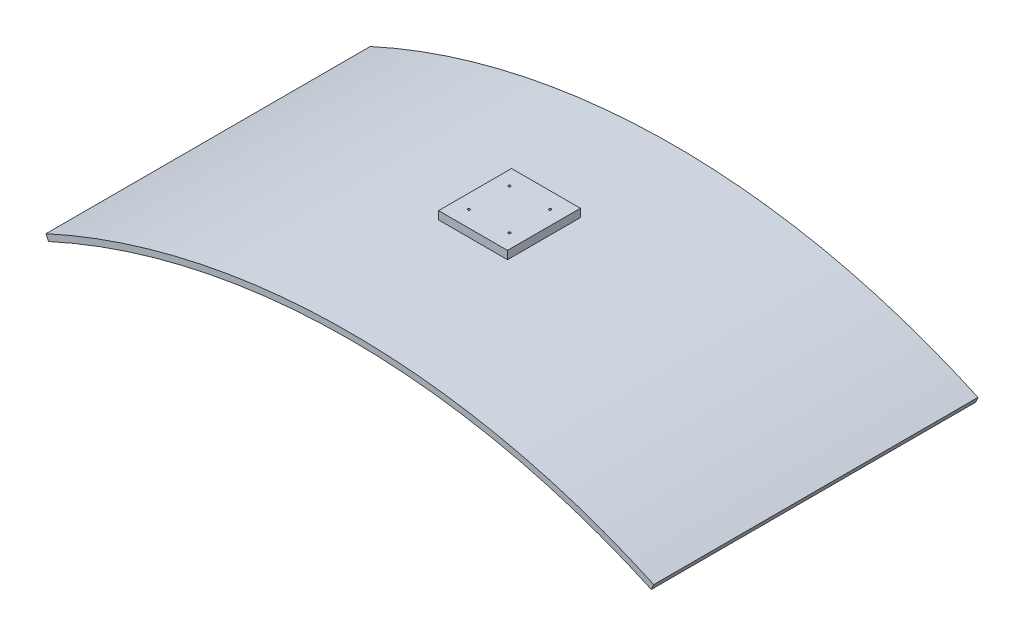
ISO-10303-21;
HEADER;
FILE_DESCRIPTION(('STEP AP214'),'2;1');
FILE_NAME('part.step','',(''),(''),'','','');
FILE_SCHEMA(('AUTOMOTIVE_DESIGN { 1 0 10303 214 1 1 1 1 }'));
ENDSEC;
DATA;
#1=APPLICATION_CONTEXT('core data for automotive mechanical design processes');
#2=APPLICATION_PROTOCOL_DEFINITION('international standard','automotive_design',2000,#1);
#3=PRODUCT_CONTEXT('',#1,'mechanical');
#4=PRODUCT('Part','Part','',(#3));
#5=PRODUCT_RELATED_PRODUCT_CATEGORY('part','',(#4));
#6=PRODUCT_DEFINITION_FORMATION('','',#4);
#7=PRODUCT_DEFINITION_CONTEXT('part definition',#1,'design');
#8=PRODUCT_DEFINITION('design','',#6,#7);
#9=PRODUCT_DEFINITION_SHAPE('','',#8);
#10=(LENGTH_UNIT() NAMED_UNIT(*) SI_UNIT(.MILLI.,.METRE.));
#11=(NAMED_UNIT(*) PLANE_ANGLE_UNIT() SI_UNIT($,.RADIAN.));
#12=(NAMED_UNIT(*) SI_UNIT($,.STERADIAN.) SOLID_ANGLE_UNIT());
#13=UNCERTAINTY_MEASURE_WITH_UNIT(LENGTH_MEASURE(1.E-05),#10,'distance_accuracy_value','');
#14=(GEOMETRIC_REPRESENTATION_CONTEXT(3) GLOBAL_UNCERTAINTY_ASSIGNED_CONTEXT((#13)) GLOBAL_UNIT_ASSIGNED_CONTEXT((#10,
#11,#12)) REPRESENTATION_CONTEXT('',''));
#15=CARTESIAN_POINT('',(0.,0.,0.));
#16=DIRECTION('',(0.,0.,1.));
#17=DIRECTION('',(1.,0.,0.));
#18=AXIS2_PLACEMENT_3D('',#15,#16,#17);
#19=CARTESIAN_POINT('',(788.75,163.693182804643,390.));
#20=DIRECTION('',(0.,1.,0.));
#21=DIRECTION('',(0.,0.,1.));
#22=AXIS2_PLACEMENT_3D('',#19,#20,#21);
#23=PLANE('',#22);
#24=DIRECTION('',(0.,0.,-1.));
#25=VECTOR('',#24,1.);
#26=CARTESIAN_POINT('',(698.75,163.693182804643,390.));
#27=LINE('',#26,#25);
#28=CARTESIAN_POINT('',(698.75,163.693182804643,410.));
#29=VERTEX_POINT('',#28);
#30=CARTESIAN_POINT('',(698.75,163.693182804643,390.));
#31=VERTEX_POINT('',#30);
#32=EDGE_CURVE('E150',#29,#31,#27,.T.);
#33=ORIENTED_EDGE('',*,*,#32,.T.);
#34=DIRECTION('',(-1.,0.,0.));
#35=VECTOR('',#34,1.);
#36=CARTESIAN_POINT('',(788.75,163.693182804643,390.));
#37=LINE('',#36,#35);
#38=CARTESIAN_POINT('',(788.75,163.693182804643,390.));
#39=VERTEX_POINT('',#38);
#40=EDGE_CURVE('E12',#39,#31,#37,.T.);
#41=ORIENTED_EDGE('',*,*,#40,.F.);
#42=DIRECTION('',(0.,0.,-1.));
#43=VECTOR('',#42,1.);
#44=CARTESIAN_POINT('',(788.75,163.693182804643,390.));
#45=LINE('',#44,#43);
#46=CARTESIAN_POINT('',(788.75,163.693182804643,410.));
#47=VERTEX_POINT('',#46);
#48=EDGE_CURVE('E159',#47,#39,#45,.T.);
#49=ORIENTED_EDGE('',*,*,#48,.F.);
#50=DIRECTION('',(-1.,0.,0.));
#51=VECTOR('',#50,1.);
#52=CARTESIAN_POINT('',(788.75,163.693182804643,410.));
#53=LINE('',#52,#51);
#54=EDGE_CURVE('E164',#47,#29,#53,.T.);
#55=ORIENTED_EDGE('',*,*,#54,.T.);
#56=EDGE_LOOP('',(#33,#41,#49,#55));
#57=FACE_BOUND('',#56,.T.);
#58=ADVANCED_FACE('F55',(#57),#23,.F.);
#59=CARTESIAN_POINT('',(788.75,163.693182804643,390.));
#60=DIRECTION('',(0.,0.,1.));
#61=DIRECTION('',(1.,0.,0.));
#62=AXIS2_PLACEMENT_3D('',#59,#60,#61);
#63=PLANE('',#62);
#64=DIRECTION('',(0.,1.,0.));
#65=VECTOR('',#64,1.);
#66=CARTESIAN_POINT('',(698.75,163.693182804643,390.));
#67=LINE('',#66,#65);
#68=CARTESIAN_POINT('',(698.75,203.693182804643,390.));
#69=VERTEX_POINT('',#68);
#70=EDGE_CURVE('E153',#31,#69,#67,.T.);
#71=ORIENTED_EDGE('',*,*,#70,.T.);
#72=DIRECTION('',(-1.,0.,0.));
#73=VECTOR('',#72,1.);
#74=CARTESIAN_POINT('',(788.75,203.693182804643,390.));
#75=LINE('',#74,#73);
#76=CARTESIAN_POINT('',(788.75,203.693182804643,390.));
#77=VERTEX_POINT('',#76);
#78=EDGE_CURVE('E63',#77,#69,#75,.T.);
#79=ORIENTED_EDGE('',*,*,#78,.F.);
#80=DIRECTION('',(0.,1.,0.));
#81=VECTOR('',#80,1.);
#82=CARTESIAN_POINT('',(788.75,163.693182804643,390.));
#83=LINE('',#82,#81);
#84=EDGE_CURVE('E95',#39,#77,#83,.T.);
#85=ORIENTED_EDGE('',*,*,#84,.F.);
#86=ORIENTED_EDGE('',*,*,#40,.T.);
#87=EDGE_LOOP('',(#71,#79,#85,#86));
#88=FACE_BOUND('',#87,.T.);
#89=ADVANCED_FACE('F177',(#88),#63,.F.);
#90=CARTESIAN_POINT('',(788.75,163.693182804643,410.));
#91=DIRECTION('',(0.,0.,-1.));
#92=DIRECTION('',(-1.,0.,0.));
#93=AXIS2_PLACEMENT_3D('',#90,#91,#92);
#94=PLANE('',#93);
#95=DIRECTION('',(0.,-1.,0.));
#96=VECTOR('',#95,1.);
#97=CARTESIAN_POINT('',(698.75,163.693182804643,410.));
#98=LINE('',#97,#96);
#99=CARTESIAN_POINT('',(698.75,203.693182804643,410.));
#100=VERTEX_POINT('',#99);
#101=EDGE_CURVE('E88',#100,#29,#98,.T.);
#102=ORIENTED_EDGE('',*,*,#101,.T.);
#103=ORIENTED_EDGE('',*,*,#54,.F.);
#104=DIRECTION('',(0.,-1.,0.));
#105=VECTOR('',#104,1.);
#106=CARTESIAN_POINT('',(788.75,163.693182804643,410.));
#107=LINE('',#106,#105);
#108=CARTESIAN_POINT('',(788.75,203.693182804643,410.));
#109=VERTEX_POINT('',#108);
#110=EDGE_CURVE('E71',#109,#47,#107,.T.);
#111=ORIENTED_EDGE('',*,*,#110,.F.);
#112=DIRECTION('',(-1.,0.,0.));
#113=VECTOR('',#112,1.);
#114=CARTESIAN_POINT('',(788.75,203.693182804643,410.));
#115=LINE('',#114,#113);
#116=EDGE_CURVE('E85',#109,#100,#115,.T.);
#117=ORIENTED_EDGE('',*,*,#116,.T.);
#118=EDGE_LOOP('',(#102,#103,#111,#117));
#119=FACE_BOUND('',#118,.T.);
#120=ADVANCED_FACE('F184',(#119),#94,.F.);
#121=CARTESIAN_POINT('',(788.75,0.,0.));
#122=DIRECTION('',(-1.,0.,0.));
#123=DIRECTION('',(0.,0.,1.));
#124=AXIS2_PLACEMENT_3D('',#121,#122,#123);
#125=PLANE('',#124);
#126=ORIENTED_EDGE('',*,*,#48,.T.);
#127=ORIENTED_EDGE('',*,*,#84,.T.);
#128=DIRECTION('',(0.,0.,1.));
#129=VECTOR('',#128,1.);
#130=CARTESIAN_POINT('',(788.75,203.693182804643,410.));
#131=LINE('',#130,#129);
#132=EDGE_CURVE('E162',#77,#109,#131,.T.);
#133=ORIENTED_EDGE('',*,*,#132,.T.);
#134=ORIENTED_EDGE('',*,*,#110,.T.);
#135=EDGE_LOOP('',(#126,#127,#133,#134));
#136=FACE_BOUND('',#135,.T.);
#137=ADVANCED_FACE('F186',(#136),#125,.F.);
#138=CARTESIAN_POINT('',(698.75,0.,0.));
#139=DIRECTION('',(-1.,0.,0.));
#140=DIRECTION('',(0.,0.,1.));
#141=AXIS2_PLACEMENT_3D('',#138,#139,#140);
#142=PLANE('',#141);
#143=ORIENTED_EDGE('',*,*,#32,.F.);
#144=ORIENTED_EDGE('',*,*,#101,.F.);
#145=DIRECTION('',(0.,0.,1.));
#146=VECTOR('',#145,1.);
#147=CARTESIAN_POINT('',(698.75,203.693182804643,410.));
#148=LINE('',#147,#146);
#149=EDGE_CURVE('E168',#69,#100,#148,.T.);
#150=ORIENTED_EDGE('',*,*,#149,.F.);
#151=ORIENTED_EDGE('',*,*,#70,.F.);
#152=EDGE_LOOP('',(#143,#144,#150,#151));
#153=FACE_BOUND('',#152,.T.);
#154=ADVANCED_FACE('F181',(#153),#142,.T.);
#155=CARTESIAN_POINT('',(0.,203.693182804643,0.));
#156=DIRECTION('',(0.,1.,0.));
#157=DIRECTION('',(0.,0.,1.));
#158=AXIS2_PLACEMENT_3D('',#155,#156,#157);
#159=PLANE('',#158);
#160=CARTESIAN_POINT('',(793.829806204046,203.693182804643,450.));
#161=DIRECTION('',(0.,1.,0.));
#162=DIRECTION('',(0.,0.,1.));
#163=AXIS2_PLACEMENT_3D('',#160,#161,#162);
#164=CIRCLE('',#163,2.99999999999993);
#165=CARTESIAN_POINT('',(793.829806204046,203.693182804643,452.999999999999));
#166=VERTEX_POINT('',#165);
#167=EDGE_CURVE('E320',#166,#166,#164,.T.);
#168=ORIENTED_EDGE('',*,*,#167,.T.);
#169=EDGE_LOOP('',(#168));
#170=FACE_BOUND('',#169,.T.);
#171=CARTESIAN_POINT('',(693.829806204047,203.693182804643,349.999999999998));
#172=DIRECTION('',(0.,1.,0.));
#173=DIRECTION('',(0.,0.,1.));
#174=AXIS2_PLACEMENT_3D('',#171,#172,#173);
#175=CIRCLE('',#174,3.00000000000005);
#176=CARTESIAN_POINT('',(693.829806204047,203.693182804643,352.999999999998));
#177=VERTEX_POINT('',#176);
#178=EDGE_CURVE('E337',#177,#177,#175,.T.);
#179=ORIENTED_EDGE('',*,*,#178,.T.);
#180=EDGE_LOOP('',(#179));
#181=FACE_BOUND('',#180,.T.);
#182=CARTESIAN_POINT('',(793.829806204047,203.693182804643,350.));
#183=DIRECTION('',(0.,1.,0.));
#184=DIRECTION('',(0.,0.,1.));
#185=AXIS2_PLACEMENT_3D('',#182,#183,#184);
#186=CIRCLE('',#185,3.00000000000005);
#187=CARTESIAN_POINT('',(793.829806204047,203.693182804643,353.));
#188=VERTEX_POINT('',#187);
#189=EDGE_CURVE('E332',#188,#188,#186,.T.);
#190=ORIENTED_EDGE('',*,*,#189,.T.);
#191=EDGE_LOOP('',(#190));
#192=FACE_BOUND('',#191,.T.);
#193=CARTESIAN_POINT('',(693.829806204046,203.693182804643,449.999999999998));
#194=DIRECTION('',(0.,1.,0.));
#195=DIRECTION('',(0.,0.,1.));
#196=AXIS2_PLACEMENT_3D('',#193,#194,#195);
#197=CIRCLE('',#196,3.00000000000005);
#198=CARTESIAN_POINT('',(693.829806204046,203.693182804643,452.999999999998));
#199=VERTEX_POINT('',#198);
#200=EDGE_CURVE('E327',#199,#199,#197,.T.);
#201=ORIENTED_EDGE('',*,*,#200,.T.);
#202=EDGE_LOOP('',(#201));
#203=FACE_BOUND('',#202,.T.);
#204=DIRECTION('',(0.,0.,-1.));
#205=VECTOR('',#204,1.);
#206=CARTESIAN_POINT('',(828.829806203977,203.693182804643,310.));
#207=LINE('',#206,#205);
#208=CARTESIAN_POINT('',(828.829806203977,203.693182804643,490.));
#209=VERTEX_POINT('',#208);
#210=CARTESIAN_POINT('',(828.829806203977,203.693182804643,310.));
#211=VERTEX_POINT('',#210);
#212=EDGE_CURVE('E149',#209,#211,#207,.T.);
#213=ORIENTED_EDGE('',*,*,#212,.F.);
#214=DIRECTION('',(1.,0.,0.));
#215=VECTOR('',#214,1.);
#216=CARTESIAN_POINT('',(658.829806203977,203.693182804643,490.));
#217=LINE('',#216,#215);
#218=CARTESIAN_POINT('',(658.829806203977,203.693182804643,490.));
#219=VERTEX_POINT('',#218);
#220=EDGE_CURVE('E145',#219,#209,#217,.T.);
#221=ORIENTED_EDGE('',*,*,#220,.F.);
#222=DIRECTION('',(0.,0.,1.));
#223=VECTOR('',#222,1.);
#224=CARTESIAN_POINT('',(658.829806203977,203.693182804643,310.));
#225=LINE('',#224,#223);
#226=CARTESIAN_POINT('',(658.829806203977,203.693182804643,310.));
#227=VERTEX_POINT('',#226);
#228=EDGE_CURVE('E349',#227,#219,#225,.T.);
#229=ORIENTED_EDGE('',*,*,#228,.F.);
#230=DIRECTION('',(-1.,0.,0.));
#231=VECTOR('',#230,1.);
#232=CARTESIAN_POINT('',(658.829806203977,203.693182804643,310.));
#233=LINE('',#232,#231);
#234=EDGE_CURVE('E347',#211,#227,#233,.T.);
#235=ORIENTED_EDGE('',*,*,#234,.F.);
#236=EDGE_LOOP('',(#213,#221,#229,#235));
#237=FACE_BOUND('',#236,.T.);
#238=ORIENTED_EDGE('',*,*,#78,.T.);
#239=ORIENTED_EDGE('',*,*,#149,.T.);
#240=ORIENTED_EDGE('',*,*,#116,.F.);
#241=ORIENTED_EDGE('',*,*,#132,.F.);
#242=EDGE_LOOP('',(#238,#239,#240,#241));
#243=FACE_BOUND('',#242,.T.);
#244=ADVANCED_FACE('F176',(#170,#181,#192,#203,#237,#243),#159,.F.);
#245=CARTESIAN_POINT('',(828.829806203977,223.693182804643,310.));
#246=DIRECTION('',(-1.,0.,0.));
#247=DIRECTION('',(0.,0.,1.));
#248=AXIS2_PLACEMENT_3D('',#245,#246,#247);
#249=PLANE('',#248);
#250=ORIENTED_EDGE('',*,*,#212,.T.);
#251=DIRECTION('',(0.,-1.,0.));
#252=VECTOR('',#251,1.);
#253=CARTESIAN_POINT('',(828.829806203977,223.693182804643,310.));
#254=LINE('',#253,#252);
#255=CARTESIAN_POINT('',(828.829806203977,223.693182804643,310.));
#256=VERTEX_POINT('',#255);
#257=EDGE_CURVE('E129',#256,#211,#254,.T.);
#258=ORIENTED_EDGE('',*,*,#257,.F.);
#259=DIRECTION('',(0.,0.,-1.));
#260=VECTOR('',#259,1.);
#261=CARTESIAN_POINT('',(828.829806203977,223.693182804643,310.));
#262=LINE('',#261,#260);
#263=CARTESIAN_POINT('',(828.829806203977,223.693182804643,490.));
#264=VERTEX_POINT('',#263);
#265=EDGE_CURVE('E136',#264,#256,#262,.T.);
#266=ORIENTED_EDGE('',*,*,#265,.F.);
#267=DIRECTION('',(0.,-1.,0.));
#268=VECTOR('',#267,1.);
#269=CARTESIAN_POINT('',(828.829806203977,223.693182804643,490.));
#270=LINE('',#269,#268);
#271=EDGE_CURVE('E345',#264,#209,#270,.T.);
#272=ORIENTED_EDGE('',*,*,#271,.T.);
#273=EDGE_LOOP('',(#250,#258,#266,#272));
#274=FACE_BOUND('',#273,.T.);
#275=ADVANCED_FACE('F147',(#274),#249,.F.);
#276=CARTESIAN_POINT('',(658.829806203977,223.693182804643,310.));
#277=DIRECTION('',(0.,0.,1.));
#278=DIRECTION('',(1.,0.,0.));
#279=AXIS2_PLACEMENT_3D('',#276,#277,#278);
#280=PLANE('',#279);
#281=ORIENTED_EDGE('',*,*,#234,.T.);
#282=DIRECTION('',(0.,-1.,0.));
#283=VECTOR('',#282,1.);
#284=CARTESIAN_POINT('',(658.829806203977,223.693182804643,310.));
#285=LINE('',#284,#283);
#286=CARTESIAN_POINT('',(658.829806203977,223.693182804643,310.));
#287=VERTEX_POINT('',#286);
#288=EDGE_CURVE('E132',#287,#227,#285,.T.);
#289=ORIENTED_EDGE('',*,*,#288,.F.);
#290=DIRECTION('',(-1.,0.,0.));
#291=VECTOR('',#290,1.);
#292=CARTESIAN_POINT('',(658.829806203977,223.693182804643,310.));
#293=LINE('',#292,#291);
#294=EDGE_CURVE('E125',#256,#287,#293,.T.);
#295=ORIENTED_EDGE('',*,*,#294,.F.);
#296=ORIENTED_EDGE('',*,*,#257,.T.);
#297=EDGE_LOOP('',(#281,#289,#295,#296));
#298=FACE_BOUND('',#297,.T.);
#299=ADVANCED_FACE('F127',(#298),#280,.F.);
#300=CARTESIAN_POINT('',(658.829806203977,223.693182804643,310.));
#301=DIRECTION('',(1.,0.,0.));
#302=DIRECTION('',(0.,0.,-1.));
#303=AXIS2_PLACEMENT_3D('',#300,#301,#302);
#304=PLANE('',#303);
#305=ORIENTED_EDGE('',*,*,#228,.T.);
#306=DIRECTION('',(0.,-1.,0.));
#307=VECTOR('',#306,1.);
#308=CARTESIAN_POINT('',(658.829806203977,223.693182804643,490.));
#309=LINE('',#308,#307);
#310=CARTESIAN_POINT('',(658.829806203977,223.693182804643,490.));
#311=VERTEX_POINT('',#310);
#312=EDGE_CURVE('E155',#311,#219,#309,.T.);
#313=ORIENTED_EDGE('',*,*,#312,.F.);
#314=DIRECTION('',(0.,0.,1.));
#315=VECTOR('',#314,1.);
#316=CARTESIAN_POINT('',(658.829806203977,223.693182804643,310.));
#317=LINE('',#316,#315);
#318=EDGE_CURVE('E135',#287,#311,#317,.T.);
#319=ORIENTED_EDGE('',*,*,#318,.F.);
#320=ORIENTED_EDGE('',*,*,#288,.T.);
#321=EDGE_LOOP('',(#305,#313,#319,#320));
#322=FACE_BOUND('',#321,.T.);
#323=ADVANCED_FACE('F248',(#322),#304,.F.);
#324=CARTESIAN_POINT('',(658.829806203977,223.693182804643,490.));
#325=DIRECTION('',(0.,0.,-1.));
#326=DIRECTION('',(-1.,0.,0.));
#327=AXIS2_PLACEMENT_3D('',#324,#325,#326);
#328=PLANE('',#327);
#329=ORIENTED_EDGE('',*,*,#220,.T.);
#330=ORIENTED_EDGE('',*,*,#271,.F.);
#331=DIRECTION('',(1.,0.,0.));
#332=VECTOR('',#331,1.);
#333=CARTESIAN_POINT('',(658.829806203977,223.693182804643,490.));
#334=LINE('',#333,#332);
#335=EDGE_CURVE('E141',#311,#264,#334,.T.);
#336=ORIENTED_EDGE('',*,*,#335,.F.);
#337=ORIENTED_EDGE('',*,*,#312,.T.);
#338=EDGE_LOOP('',(#329,#330,#336,#337));
#339=FACE_BOUND('',#338,.T.);
#340=ADVANCED_FACE('F257',(#339),#328,.F.);
#341=CARTESIAN_POINT('',(0.,223.693182804643,0.));
#342=DIRECTION('',(0.,1.,0.));
#343=DIRECTION('',(0.,0.,1.));
#344=AXIS2_PLACEMENT_3D('',#341,#342,#343);
#345=PLANE('',#344);
#346=CARTESIAN_POINT('',(793.829806204046,223.693182804643,450.));
#347=DIRECTION('',(0.,1.,0.));
#348=DIRECTION('',(0.,0.,1.));
#349=AXIS2_PLACEMENT_3D('',#346,#347,#348);
#350=CIRCLE('',#349,2.99999999999993);
#351=CARTESIAN_POINT('',(793.829806204046,223.693182804643,452.999999999999));
#352=VERTEX_POINT('',#351);
#353=EDGE_CURVE('E323',#352,#352,#350,.T.);
#354=ORIENTED_EDGE('',*,*,#353,.F.);
#355=EDGE_LOOP('',(#354));
#356=FACE_BOUND('',#355,.T.);
#357=CARTESIAN_POINT('',(693.829806204047,223.693182804643,349.999999999998));
#358=DIRECTION('',(0.,1.,0.));
#359=DIRECTION('',(0.,0.,1.));
#360=AXIS2_PLACEMENT_3D('',#357,#358,#359);
#361=CIRCLE('',#360,3.00000000000005);
#362=CARTESIAN_POINT('',(693.829806204047,223.693182804643,352.999999999998));
#363=VERTEX_POINT('',#362);
#364=EDGE_CURVE('E329',#363,#363,#361,.T.);
#365=ORIENTED_EDGE('',*,*,#364,.F.);
#366=EDGE_LOOP('',(#365));
#367=FACE_BOUND('',#366,.T.);
#368=CARTESIAN_POINT('',(793.829806204047,223.693182804643,350.));
#369=DIRECTION('',(0.,1.,0.));
#370=DIRECTION('',(0.,0.,1.));
#371=AXIS2_PLACEMENT_3D('',#368,#369,#370);
#372=CIRCLE('',#371,3.00000000000005);
#373=CARTESIAN_POINT('',(793.829806204047,223.693182804643,353.));
#374=VERTEX_POINT('',#373);
#375=EDGE_CURVE('E340',#374,#374,#372,.T.);
#376=ORIENTED_EDGE('',*,*,#375,.F.);
#377=EDGE_LOOP('',(#376));
#378=FACE_BOUND('',#377,.T.);
#379=CARTESIAN_POINT('',(693.829806204046,223.693182804643,449.999999999998));
#380=DIRECTION('',(0.,1.,0.));
#381=DIRECTION('',(0.,0.,1.));
#382=AXIS2_PLACEMENT_3D('',#379,#380,#381);
#383=CIRCLE('',#382,3.00000000000005);
#384=CARTESIAN_POINT('',(693.829806204046,223.693182804643,452.999999999998));
#385=VERTEX_POINT('',#384);
#386=EDGE_CURVE('E324',#385,#385,#383,.T.);
#387=ORIENTED_EDGE('',*,*,#386,.F.);
#388=EDGE_LOOP('',(#387));
#389=FACE_BOUND('',#388,.T.);
#390=ORIENTED_EDGE('',*,*,#265,.T.);
#391=ORIENTED_EDGE('',*,*,#294,.T.);
#392=ORIENTED_EDGE('',*,*,#318,.T.);
#393=ORIENTED_EDGE('',*,*,#335,.T.);
#394=EDGE_LOOP('',(#390,#391,#392,#393));
#395=FACE_BOUND('',#394,.T.);
#396=ADVANCED_FACE('F139',(#356,#367,#378,#389,#395),#345,.T.);
#397=CARTESIAN_POINT('',(693.829806204046,203.693182804643,449.999999999998));
#398=DIRECTION('',(0.,1.,0.));
#399=DIRECTION('',(0.,0.,1.));
#400=AXIS2_PLACEMENT_3D('',#397,#398,#399);
#401=CYLINDRICAL_SURFACE('',#400,3.00000000000005);
#402=ORIENTED_EDGE('',*,*,#200,.F.);
#403=EDGE_LOOP('',(#402));
#404=FACE_BOUND('',#403,.T.);
#405=ORIENTED_EDGE('',*,*,#386,.T.);
#406=EDGE_LOOP('',(#405));
#407=FACE_BOUND('',#406,.T.);
#408=ADVANCED_FACE('F274',(#404,#407),#401,.F.);
#409=CARTESIAN_POINT('',(793.829806204047,203.693182804643,350.));
#410=DIRECTION('',(0.,1.,0.));
#411=DIRECTION('',(0.,0.,1.));
#412=AXIS2_PLACEMENT_3D('',#409,#410,#411);
#413=CYLINDRICAL_SURFACE('',#412,3.00000000000005);
#414=ORIENTED_EDGE('',*,*,#189,.F.);
#415=EDGE_LOOP('',(#414));
#416=FACE_BOUND('',#415,.T.);
#417=ORIENTED_EDGE('',*,*,#375,.T.);
#418=EDGE_LOOP('',(#417));
#419=FACE_BOUND('',#418,.T.);
#420=ADVANCED_FACE('F284',(#416,#419),#413,.F.);
#421=CARTESIAN_POINT('',(693.829806204047,203.693182804643,349.999999999998));
#422=DIRECTION('',(0.,1.,0.));
#423=DIRECTION('',(0.,0.,1.));
#424=AXIS2_PLACEMENT_3D('',#421,#422,#423);
#425=CYLINDRICAL_SURFACE('',#424,3.00000000000005);
#426=ORIENTED_EDGE('',*,*,#178,.F.);
#427=EDGE_LOOP('',(#426));
#428=FACE_BOUND('',#427,.T.);
#429=ORIENTED_EDGE('',*,*,#364,.T.);
#430=EDGE_LOOP('',(#429));
#431=FACE_BOUND('',#430,.T.);
#432=ADVANCED_FACE('F294',(#428,#431),#425,.F.);
#433=CARTESIAN_POINT('',(793.829806204046,203.693182804643,450.));
#434=DIRECTION('',(0.,1.,0.));
#435=DIRECTION('',(0.,0.,1.));
#436=AXIS2_PLACEMENT_3D('',#433,#434,#435);
#437=CYLINDRICAL_SURFACE('',#436,2.99999999999993);
#438=ORIENTED_EDGE('',*,*,#167,.F.);
#439=EDGE_LOOP('',(#438));
#440=FACE_BOUND('',#439,.T.);
#441=ORIENTED_EDGE('',*,*,#353,.T.);
#442=EDGE_LOOP('',(#441));
#443=FACE_BOUND('',#442,.T.);
#444=ADVANCED_FACE('F304',(#440,#443),#437,.F.);
#445=CLOSED_SHELL('',(#58,#89,#120,#137,#154,#244,#275,#299,#323,#340,#396,#408,#420,#432,#444));
#446=MANIFOLD_SOLID_BREP('B2',#445);
#447=CARTESIAN_POINT('',(750.,-1636.30681719536,800.));
#448=DIRECTION('',(0.,0.,-1.));
#449=DIRECTION('',(-1.,0.,0.));
#450=AXIS2_PLACEMENT_3D('',#447,#448,#449);
#451=CYLINDRICAL_SURFACE('',#450,1785.);
#452=CARTESIAN_POINT('',(750.,-1636.30681719536,0.));
#453=DIRECTION('',(0.,0.,1.));
#454=DIRECTION('',(1.,0.,0.));
#455=AXIS2_PLACEMENT_3D('',#452,#453,#454);
#456=CIRCLE('',#455,1785.);
#457=CARTESIAN_POINT('',(6.24999999999976,-13.6358901432947,0.));
#458=VERTEX_POINT('',#457);
#459=CARTESIAN_POINT('',(1493.75,-13.6358901432949,0.));
#460=VERTEX_POINT('',#459);
#461=EDGE_CURVE('E487',#458,#460,#456,.F.);
#462=ORIENTED_EDGE('',*,*,#461,.T.);
#463=DIRECTION('',(0.,0.,-1.));
#464=VECTOR('',#463,1.);
#465=CARTESIAN_POINT('',(1493.75,-13.6358901432949,800.));
#466=LINE('',#465,#464);
#467=CARTESIAN_POINT('',(1493.75,-13.6358901432949,800.));
#468=VERTEX_POINT('',#467);
#469=EDGE_CURVE('E53',#468,#460,#466,.T.);
#470=ORIENTED_EDGE('',*,*,#469,.F.);
#471=CARTESIAN_POINT('',(750.,-1636.30681719536,800.));
#472=DIRECTION('',(0.,0.,1.));
#473=DIRECTION('',(1.,0.,0.));
#474=AXIS2_PLACEMENT_3D('',#471,#472,#473);
#475=CIRCLE('',#474,1785.);
#476=CARTESIAN_POINT('',(6.24999999999976,-13.6358901432947,800.));
#477=VERTEX_POINT('',#476);
#478=EDGE_CURVE('E426',#477,#468,#475,.F.);
#479=ORIENTED_EDGE('',*,*,#478,.F.);
#480=DIRECTION('',(0.,0.,-1.));
#481=VECTOR('',#480,1.);
#482=CARTESIAN_POINT('',(6.24999999999976,-13.6358901432947,800.));
#483=LINE('',#482,#481);
#484=EDGE_CURVE('E401',#477,#458,#483,.T.);
#485=ORIENTED_EDGE('',*,*,#484,.T.);
#486=EDGE_LOOP('',(#462,#470,#479,#485));
#487=FACE_BOUND('',#486,.T.);
#488=CARTESIAN_POINT('',(750.,-1636.30681719536,10.));
#489=DIRECTION('',(0.,0.,-1.));
#490=DIRECTION('',(1.,0.,0.));
#491=AXIS2_PLACEMENT_3D('',#488,#489,#490);
#492=CIRCLE('',#491,1785.);
#493=CARTESIAN_POINT('',(15.3522648556415,-9.49468752356689,10.));
#494=VERTEX_POINT('',#493);
#495=CARTESIAN_POINT('',(1484.64773514436,-9.49468752356708,10.));
#496=VERTEX_POINT('',#495);
#497=EDGE_CURVE('E470',#494,#496,#492,.T.);
#498=ORIENTED_EDGE('',*,*,#497,.F.);
#499=DIRECTION('',(0.,0.,1.));
#500=VECTOR('',#499,1.);
#501=CARTESIAN_POINT('',(15.3522648556415,-9.49468752356689,10.));
#502=LINE('',#501,#500);
#503=CARTESIAN_POINT('',(15.3522648556415,-9.49468752356689,790.));
#504=VERTEX_POINT('',#503);
#505=EDGE_CURVE('E461',#494,#504,#502,.T.);
#506=ORIENTED_EDGE('',*,*,#505,.T.);
#507=CARTESIAN_POINT('',(750.,-1636.30681719536,790.));
#508=DIRECTION('',(0.,0.,-1.));
#509=DIRECTION('',(1.,0.,0.));
#510=AXIS2_PLACEMENT_3D('',#507,#508,#509);
#511=CIRCLE('',#510,1785.);
#512=CARTESIAN_POINT('',(1484.64773514436,-9.49468752356708,790.));
#513=VERTEX_POINT('',#512);
#514=EDGE_CURVE('E475',#504,#513,#511,.T.);
#515=ORIENTED_EDGE('',*,*,#514,.T.);
#516=DIRECTION('',(0.,0.,1.));
#517=VECTOR('',#516,1.);
#518=CARTESIAN_POINT('',(1484.64773514436,-9.49468752356708,10.));
#519=LINE('',#518,#517);
#520=EDGE_CURVE('E488',#496,#513,#519,.T.);
#521=ORIENTED_EDGE('',*,*,#520,.F.);
#522=EDGE_LOOP('',(#498,#506,#515,#521));
#523=FACE_BOUND('',#522,.T.);
#524=ADVANCED_FACE('F378',(#487,#523),#451,.F.);
#525=CARTESIAN_POINT('',(1500.,0.,800.));
#526=DIRECTION('',(0.909059342886316,-0.416666666666652,0.));
#527=DIRECTION('',(0.416666666666652,0.909059342886316,0.));
#528=AXIS2_PLACEMENT_3D('',#525,#526,#527);
#529=PLANE('',#528);
#530=DIRECTION('',(-0.416666666666652,-0.909059342886316,0.));
#531=VECTOR('',#530,1.);
#532=CARTESIAN_POINT('',(1500.,0.,0.));
#533=LINE('',#532,#531);
#534=CARTESIAN_POINT('',(1500.,0.,0.));
#535=VERTEX_POINT('',#534);
#536=EDGE_CURVE('E502',#535,#460,#533,.T.);
#537=ORIENTED_EDGE('',*,*,#536,.F.);
#538=DIRECTION('',(0.,0.,-1.));
#539=VECTOR('',#538,1.);
#540=CARTESIAN_POINT('',(1500.,0.,800.));
#541=LINE('',#540,#539);
#542=CARTESIAN_POINT('',(1500.,0.,800.));
#543=VERTEX_POINT('',#542);
#544=EDGE_CURVE('E385',#543,#535,#541,.T.);
#545=ORIENTED_EDGE('',*,*,#544,.F.);
#546=DIRECTION('',(-0.416666666666652,-0.909059342886316,0.));
#547=VECTOR('',#546,1.);
#548=CARTESIAN_POINT('',(1500.,0.,800.));
#549=LINE('',#548,#547);
#550=EDGE_CURVE('E492',#543,#468,#549,.T.);
#551=ORIENTED_EDGE('',*,*,#550,.T.);
#552=ORIENTED_EDGE('',*,*,#469,.T.);
#553=EDGE_LOOP('',(#537,#545,#551,#552));
#554=FACE_BOUND('',#553,.T.);
#555=ADVANCED_FACE('F518',(#554),#529,.T.);
#556=CARTESIAN_POINT('',(750.,-1636.30681719536,800.));
#557=DIRECTION('',(0.,0.,-1.));
#558=DIRECTION('',(-1.,0.,0.));
#559=AXIS2_PLACEMENT_3D('',#556,#557,#558);
#560=CYLINDRICAL_SURFACE('',#559,1800.);
#561=CARTESIAN_POINT('',(750.,-1636.30681719536,0.));
#562=DIRECTION('',(0.,0.,-1.));
#563=DIRECTION('',(-1.,0.,0.));
#564=AXIS2_PLACEMENT_3D('',#561,#562,#563);
#565=CIRCLE('',#564,1800.);
#566=CARTESIAN_POINT('',(0.,0.,0.));
#567=VERTEX_POINT('',#566);
#568=EDGE_CURVE('E505',#567,#535,#565,.T.);
#569=ORIENTED_EDGE('',*,*,#568,.F.);
#570=DIRECTION('',(0.,0.,-1.));
#571=VECTOR('',#570,1.);
#572=CARTESIAN_POINT('',(0.,0.,800.));
#573=LINE('',#572,#571);
#574=CARTESIAN_POINT('',(0.,0.,800.));
#575=VERTEX_POINT('',#574);
#576=EDGE_CURVE('E511',#575,#567,#573,.T.);
#577=ORIENTED_EDGE('',*,*,#576,.F.);
#578=CARTESIAN_POINT('',(750.,-1636.30681719536,800.));
#579=DIRECTION('',(0.,0.,-1.));
#580=DIRECTION('',(-1.,0.,0.));
#581=AXIS2_PLACEMENT_3D('',#578,#579,#580);
#582=CIRCLE('',#581,1800.);
#583=EDGE_CURVE('E496',#575,#543,#582,.T.);
#584=ORIENTED_EDGE('',*,*,#583,.T.);
#585=ORIENTED_EDGE('',*,*,#544,.T.);
#586=EDGE_LOOP('',(#569,#577,#584,#585));
#587=FACE_BOUND('',#586,.T.);
#588=ADVANCED_FACE('F515',(#587),#560,.T.);
#589=CARTESIAN_POINT('',(6.24999999999976,-13.6358901432947,800.));
#590=DIRECTION('',(-0.909059342886316,-0.416666666666652,0.));
#591=DIRECTION('',(0.416666666666652,-0.909059342886316,0.));
#592=AXIS2_PLACEMENT_3D('',#589,#590,#591);
#593=PLANE('',#592);
#594=DIRECTION('',(-0.416666666666652,0.909059342886316,0.));
#595=VECTOR('',#594,1.);
#596=CARTESIAN_POINT('',(6.24999999999976,-13.6358901432947,0.));
#597=LINE('',#596,#595);
#598=EDGE_CURVE('E493',#458,#567,#597,.T.);
#599=ORIENTED_EDGE('',*,*,#598,.F.);
#600=ORIENTED_EDGE('',*,*,#484,.F.);
#601=DIRECTION('',(-0.416666666666652,0.909059342886316,0.));
#602=VECTOR('',#601,1.);
#603=CARTESIAN_POINT('',(6.24999999999976,-13.6358901432947,800.));
#604=LINE('',#603,#602);
#605=EDGE_CURVE('E499',#477,#575,#604,.T.);
#606=ORIENTED_EDGE('',*,*,#605,.T.);
#607=ORIENTED_EDGE('',*,*,#576,.T.);
#608=EDGE_LOOP('',(#599,#600,#606,#607));
#609=FACE_BOUND('',#608,.T.);
#610=ADVANCED_FACE('F521',(#609),#593,.T.);
#611=CARTESIAN_POINT('',(750.,-1636.30681719536,800.));
#612=DIRECTION('',(0.,0.,1.));
#613=DIRECTION('',(1.,0.,0.));
#614=AXIS2_PLACEMENT_3D('',#611,#612,#613);
#615=PLANE('',#614);
#616=ORIENTED_EDGE('',*,*,#478,.T.);
#617=ORIENTED_EDGE('',*,*,#550,.F.);
#618=ORIENTED_EDGE('',*,*,#583,.F.);
#619=ORIENTED_EDGE('',*,*,#605,.F.);
#620=EDGE_LOOP('',(#616,#617,#618,#619));
#621=FACE_BOUND('',#620,.T.);
#622=ADVANCED_FACE('F522',(#621),#615,.T.);
#623=CARTESIAN_POINT('',(750.,-1636.30681719536,0.));
#624=DIRECTION('',(0.,0.,1.));
#625=DIRECTION('',(1.,0.,0.));
#626=AXIS2_PLACEMENT_3D('',#623,#624,#625);
#627=PLANE('',#626);
#628=ORIENTED_EDGE('',*,*,#461,.F.);
#629=ORIENTED_EDGE('',*,*,#598,.T.);
#630=ORIENTED_EDGE('',*,*,#568,.T.);
#631=ORIENTED_EDGE('',*,*,#536,.T.);
#632=EDGE_LOOP('',(#628,#629,#630,#631));
#633=FACE_BOUND('',#632,.T.);
#634=ADVANCED_FACE('F520',(#633),#627,.F.);
#635=CARTESIAN_POINT('',(750.,-1636.30681719536,10.));
#636=DIRECTION('',(0.,0.,1.));
#637=DIRECTION('',(1.,0.,0.));
#638=AXIS2_PLACEMENT_3D('',#635,#636,#637);
#639=CYLINDRICAL_SURFACE('',#638,1786.);
#640=CARTESIAN_POINT('',(750.,-1636.30681719536,790.));
#641=DIRECTION('',(0.,0.,1.));
#642=DIRECTION('',(1.,0.,0.));
#643=AXIS2_PLACEMENT_3D('',#640,#641,#642);
#644=CIRCLE('',#643,1786.);
#645=CARTESIAN_POINT('',(1485.06440834608,-8.58561392287236,790.));
#646=VERTEX_POINT('',#645);
#647=CARTESIAN_POINT('',(14.9355916539191,-8.58561392287197,790.));
#648=VERTEX_POINT('',#647);
#649=EDGE_CURVE('E457',#646,#648,#644,.T.);
#650=ORIENTED_EDGE('',*,*,#649,.T.);
#651=DIRECTION('',(0.,0.,1.));
#652=VECTOR('',#651,1.);
#653=CARTESIAN_POINT('',(14.9355916539191,-8.58561392287197,10.));
#654=LINE('',#653,#652);
#655=CARTESIAN_POINT('',(14.9355916539191,-8.58561392287197,10.));
#656=VERTEX_POINT('',#655);
#657=EDGE_CURVE('E451',#656,#648,#654,.T.);
#658=ORIENTED_EDGE('',*,*,#657,.F.);
#659=CARTESIAN_POINT('',(750.,-1636.30681719536,10.));
#660=DIRECTION('',(0.,0.,1.));
#661=DIRECTION('',(1.,0.,0.));
#662=AXIS2_PLACEMENT_3D('',#659,#660,#661);
#663=CIRCLE('',#662,1786.);
#664=CARTESIAN_POINT('',(1485.06440834608,-8.58561392287236,10.));
#665=VERTEX_POINT('',#664);
#666=EDGE_CURVE('E455',#665,#656,#663,.T.);
#667=ORIENTED_EDGE('',*,*,#666,.F.);
#668=DIRECTION('',(0.,0.,1.));
#669=VECTOR('',#668,1.);
#670=CARTESIAN_POINT('',(1485.06440834608,-8.58561392287236,10.));
#671=LINE('',#670,#669);
#672=EDGE_CURVE('E485',#665,#646,#671,.T.);
#673=ORIENTED_EDGE('',*,*,#672,.T.);
#674=EDGE_LOOP('',(#650,#658,#667,#673));
#675=FACE_BOUND('',#674,.T.);
#676=ADVANCED_FACE('F453',(#675),#639,.F.);
#677=CARTESIAN_POINT('',(1485.06440834608,-8.58561392287236,10.));
#678=DIRECTION('',(0.909059342886197,-0.416666666666912,0.));
#679=DIRECTION('',(0.416666666666912,0.909059342886197,0.));
#680=AXIS2_PLACEMENT_3D('',#677,#678,#679);
#681=PLANE('',#680);
#682=DIRECTION('',(0.416666666666912,0.909059342886197,0.));
#683=VECTOR('',#682,1.);
#684=CARTESIAN_POINT('',(1485.06440834608,-8.58561392287236,790.));
#685=LINE('',#684,#683);
#686=EDGE_CURVE('E392',#513,#646,#685,.T.);
#687=ORIENTED_EDGE('',*,*,#686,.T.);
#688=ORIENTED_EDGE('',*,*,#672,.F.);
#689=DIRECTION('',(0.416666666666912,0.909059342886197,0.));
#690=VECTOR('',#689,1.);
#691=CARTESIAN_POINT('',(1485.06440834608,-8.58561392287236,10.));
#692=LINE('',#691,#690);
#693=EDGE_CURVE('E462',#496,#665,#692,.T.);
#694=ORIENTED_EDGE('',*,*,#693,.F.);
#695=ORIENTED_EDGE('',*,*,#520,.T.);
#696=EDGE_LOOP('',(#687,#688,#694,#695));
#697=FACE_BOUND('',#696,.T.);
#698=ADVANCED_FACE('F539',(#697),#681,.F.);
#699=CARTESIAN_POINT('',(15.3522648556415,-9.49468752356689,10.));
#700=DIRECTION('',(-0.909059342886339,-0.416666666666602,0.));
#701=DIRECTION('',(0.416666666666602,-0.909059342886339,0.));
#702=AXIS2_PLACEMENT_3D('',#699,#700,#701);
#703=PLANE('',#702);
#704=DIRECTION('',(0.416666666666602,-0.909059342886339,0.));
#705=VECTOR('',#704,1.);
#706=CARTESIAN_POINT('',(15.3522648556415,-9.49468752356689,790.));
#707=LINE('',#706,#705);
#708=EDGE_CURVE('E481',#648,#504,#707,.T.);
#709=ORIENTED_EDGE('',*,*,#708,.T.);
#710=ORIENTED_EDGE('',*,*,#505,.F.);
#711=DIRECTION('',(0.416666666666602,-0.909059342886339,0.));
#712=VECTOR('',#711,1.);
#713=CARTESIAN_POINT('',(15.3522648556415,-9.49468752356689,10.));
#714=LINE('',#713,#712);
#715=EDGE_CURVE('E465',#656,#494,#714,.T.);
#716=ORIENTED_EDGE('',*,*,#715,.F.);
#717=ORIENTED_EDGE('',*,*,#657,.T.);
#718=EDGE_LOOP('',(#709,#710,#716,#717));
#719=FACE_BOUND('',#718,.T.);
#720=ADVANCED_FACE('F466',(#719),#703,.F.);
#721=CARTESIAN_POINT('',(750.,-1636.30681719536,10.));
#722=DIRECTION('',(0.,0.,1.));
#723=DIRECTION('',(1.,0.,0.));
#724=AXIS2_PLACEMENT_3D('',#721,#722,#723);
#725=PLANE('',#724);
#726=ORIENTED_EDGE('',*,*,#666,.T.);
#727=ORIENTED_EDGE('',*,*,#715,.T.);
#728=ORIENTED_EDGE('',*,*,#497,.T.);
#729=ORIENTED_EDGE('',*,*,#693,.T.);
#730=EDGE_LOOP('',(#726,#727,#728,#729));
#731=FACE_BOUND('',#730,.T.);
#732=ADVANCED_FACE('F472',(#731),#725,.T.);
#733=CARTESIAN_POINT('',(750.,-1636.30681719536,790.));
#734=DIRECTION('',(0.,0.,1.));
#735=DIRECTION('',(1.,0.,0.));
#736=AXIS2_PLACEMENT_3D('',#733,#734,#735);
#737=PLANE('',#736);
#738=ORIENTED_EDGE('',*,*,#649,.F.);
#739=ORIENTED_EDGE('',*,*,#686,.F.);
#740=ORIENTED_EDGE('',*,*,#514,.F.);
#741=ORIENTED_EDGE('',*,*,#708,.F.);
#742=EDGE_LOOP('',(#738,#739,#740,#741));
#743=FACE_BOUND('',#742,.T.);
#744=ADVANCED_FACE('F540',(#743),#737,.F.);
#745=CLOSED_SHELL('',(#524,#555,#588,#610,#622,#634,#676,#698,#720,#732,#744));
#746=MANIFOLD_SOLID_BREP('B6',#745);
#747=ADVANCED_BREP_SHAPE_REPRESENTATION('',(#18,#446,#746),#14);
#748=SHAPE_DEFINITION_REPRESENTATION(#9,#747);
ENDSEC;
END-ISO-10303-21;
